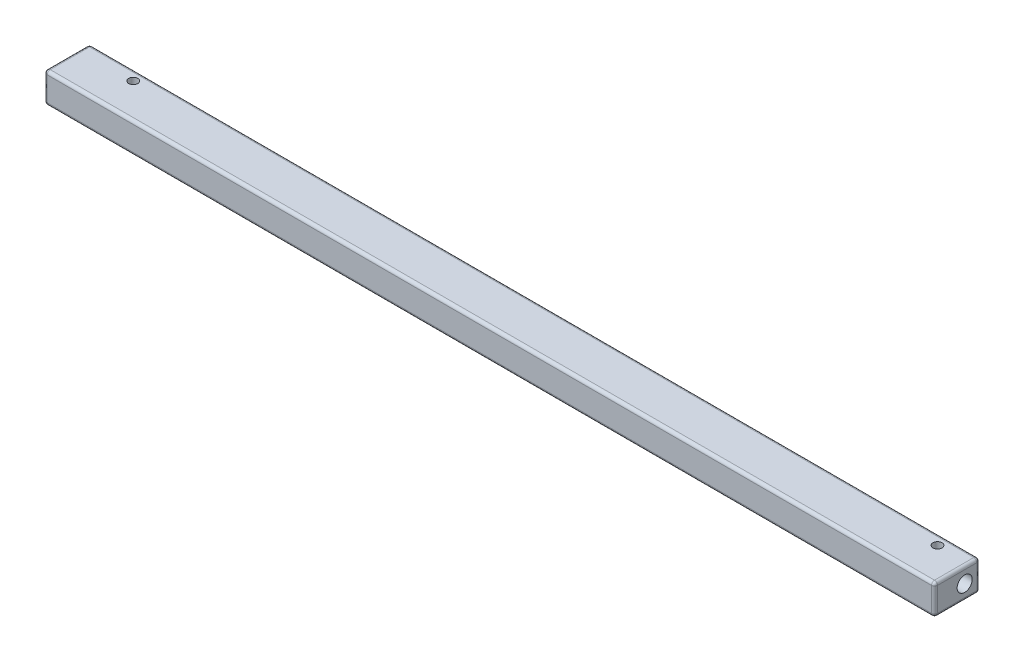
ISO-10303-21;
HEADER;
FILE_DESCRIPTION(('STEP AP214'),'2;1');
FILE_NAME('part.step','',(''),(''),'','','');
FILE_SCHEMA(('AUTOMOTIVE_DESIGN { 1 0 10303 214 1 1 1 1 }'));
ENDSEC;
DATA;
#1=APPLICATION_CONTEXT('core data for automotive mechanical design processes');
#2=APPLICATION_PROTOCOL_DEFINITION('international standard','automotive_design',2000,#1);
#3=PRODUCT_CONTEXT('',#1,'mechanical');
#4=PRODUCT('Part','Part','',(#3));
#5=PRODUCT_RELATED_PRODUCT_CATEGORY('part','',(#4));
#6=PRODUCT_DEFINITION_FORMATION('','',#4);
#7=PRODUCT_DEFINITION_CONTEXT('part definition',#1,'design');
#8=PRODUCT_DEFINITION('design','',#6,#7);
#9=PRODUCT_DEFINITION_SHAPE('','',#8);
#10=(LENGTH_UNIT() NAMED_UNIT(*) SI_UNIT(.MILLI.,.METRE.));
#11=(NAMED_UNIT(*) PLANE_ANGLE_UNIT() SI_UNIT($,.RADIAN.));
#12=(NAMED_UNIT(*) SI_UNIT($,.STERADIAN.) SOLID_ANGLE_UNIT());
#13=UNCERTAINTY_MEASURE_WITH_UNIT(LENGTH_MEASURE(1.E-05),#10,'distance_accuracy_value','');
#14=(GEOMETRIC_REPRESENTATION_CONTEXT(3) GLOBAL_UNCERTAINTY_ASSIGNED_CONTEXT((#13)) GLOBAL_UNIT_ASSIGNED_CONTEXT((#10,
#11,#12)) REPRESENTATION_CONTEXT('',''));
#15=CARTESIAN_POINT('',(0.,0.,0.));
#16=DIRECTION('',(0.,0.,1.));
#17=DIRECTION('',(1.,0.,0.));
#18=AXIS2_PLACEMENT_3D('',#15,#16,#17);
#19=CARTESIAN_POINT('',(-295.,20.,30.));
#20=DIRECTION('',(1.,0.,0.));
#21=DIRECTION('',(0.,0.,-1.));
#22=AXIS2_PLACEMENT_3D('',#19,#20,#21);
#23=PLANE('',#22);
#24=CARTESIAN_POINT('',(-295.,10.,15.));
#25=DIRECTION('',(-1.,0.,0.));
#26=DIRECTION('',(0.,0.,1.));
#27=AXIS2_PLACEMENT_3D('',#24,#25,#26);
#28=CIRCLE('',#27,5.);
#29=CARTESIAN_POINT('',(-295.,10.,20.));
#30=VERTEX_POINT('',#29);
#31=EDGE_CURVE('E450',#30,#30,#28,.T.);
#32=ORIENTED_EDGE('',*,*,#31,.F.);
#33=EDGE_LOOP('',(#32));
#34=FACE_BOUND('',#33,.T.);
#35=DIRECTION('',(0.,-1.,0.));
#36=VECTOR('',#35,1.);
#37=CARTESIAN_POINT('',(-295.,20.,2.));
#38=LINE('',#37,#36);
#39=CARTESIAN_POINT('',(-295.,18.,2.));
#40=VERTEX_POINT('',#39);
#41=CARTESIAN_POINT('',(-295.,2.,2.));
#42=VERTEX_POINT('',#41);
#43=EDGE_CURVE('E189',#40,#42,#38,.T.);
#44=ORIENTED_EDGE('',*,*,#43,.T.);
#45=DIRECTION('',(0.,0.,-1.));
#46=VECTOR('',#45,1.);
#47=CARTESIAN_POINT('',(-295.,2.,30.));
#48=LINE('',#47,#46);
#49=CARTESIAN_POINT('',(-295.,2.,28.));
#50=VERTEX_POINT('',#49);
#51=EDGE_CURVE('E192',#42,#50,#48,.F.);
#52=ORIENTED_EDGE('',*,*,#51,.T.);
#53=DIRECTION('',(0.,-1.,0.));
#54=VECTOR('',#53,1.);
#55=CARTESIAN_POINT('',(-295.,20.,28.));
#56=LINE('',#55,#54);
#57=CARTESIAN_POINT('',(-295.,18.,28.));
#58=VERTEX_POINT('',#57);
#59=EDGE_CURVE('E183',#50,#58,#56,.F.);
#60=ORIENTED_EDGE('',*,*,#59,.T.);
#61=DIRECTION('',(0.,0.,-1.));
#62=VECTOR('',#61,1.);
#63=CARTESIAN_POINT('',(-295.,18.,30.));
#64=LINE('',#63,#62);
#65=EDGE_CURVE('E186',#58,#40,#64,.T.);
#66=ORIENTED_EDGE('',*,*,#65,.T.);
#67=EDGE_LOOP('',(#44,#52,#60,#66));
#68=FACE_BOUND('',#67,.T.);
#69=ADVANCED_FACE('F42',(#34,#68),#23,.F.);
#70=CARTESIAN_POINT('',(-295.,0.,30.));
#71=DIRECTION('',(0.,1.,0.));
#72=DIRECTION('',(0.,0.,1.));
#73=AXIS2_PLACEMENT_3D('',#70,#71,#72);
#74=PLANE('',#73);
#75=CARTESIAN_POINT('',(274.,0.,7.));
#76=DIRECTION('',(0.,-1.,0.));
#77=DIRECTION('',(0.,0.,-1.));
#78=AXIS2_PLACEMENT_3D('',#75,#76,#77);
#79=CIRCLE('',#78,2.99999999999999);
#80=CARTESIAN_POINT('',(274.,0.,4.00000000000001));
#81=VERTEX_POINT('',#80);
#82=EDGE_CURVE('E444',#81,#81,#79,.T.);
#83=ORIENTED_EDGE('',*,*,#82,.F.);
#84=EDGE_LOOP('',(#83));
#85=FACE_BOUND('',#84,.T.);
#86=CARTESIAN_POINT('',(-259.,0.,7.));
#87=DIRECTION('',(0.,-1.,0.));
#88=DIRECTION('',(0.,0.,1.));
#89=AXIS2_PLACEMENT_3D('',#86,#87,#88);
#90=CIRCLE('',#89,2.99999999999999);
#91=CARTESIAN_POINT('',(-259.,0.,9.99999999999999));
#92=VERTEX_POINT('',#91);
#93=EDGE_CURVE('E446',#92,#92,#90,.T.);
#94=ORIENTED_EDGE('',*,*,#93,.F.);
#95=EDGE_LOOP('',(#94));
#96=FACE_BOUND('',#95,.T.);
#97=DIRECTION('',(1.,0.,0.));
#98=VECTOR('',#97,1.);
#99=CARTESIAN_POINT('',(-295.,0.,28.));
#100=LINE('',#99,#98);
#101=CARTESIAN_POINT('',(293.,0.,28.));
#102=VERTEX_POINT('',#101);
#103=CARTESIAN_POINT('',(-293.,0.,28.));
#104=VERTEX_POINT('',#103);
#105=EDGE_CURVE('E139',#102,#104,#100,.F.);
#106=ORIENTED_EDGE('',*,*,#105,.T.);
#107=DIRECTION('',(0.,0.,-1.));
#108=VECTOR('',#107,1.);
#109=CARTESIAN_POINT('',(-293.,0.,30.));
#110=LINE('',#109,#108);
#111=CARTESIAN_POINT('',(-293.,0.,2.));
#112=VERTEX_POINT('',#111);
#113=EDGE_CURVE('E180',#104,#112,#110,.T.);
#114=ORIENTED_EDGE('',*,*,#113,.T.);
#115=DIRECTION('',(1.,0.,0.));
#116=VECTOR('',#115,1.);
#117=CARTESIAN_POINT('',(-295.,0.,2.));
#118=LINE('',#117,#116);
#119=CARTESIAN_POINT('',(293.,0.,2.));
#120=VERTEX_POINT('',#119);
#121=EDGE_CURVE('E141',#112,#120,#118,.T.);
#122=ORIENTED_EDGE('',*,*,#121,.T.);
#123=DIRECTION('',(0.,0.,-1.));
#124=VECTOR('',#123,1.);
#125=CARTESIAN_POINT('',(293.,0.,30.));
#126=LINE('',#125,#124);
#127=EDGE_CURVE('E134',#120,#102,#126,.F.);
#128=ORIENTED_EDGE('',*,*,#127,.T.);
#129=EDGE_LOOP('',(#106,#114,#122,#128));
#130=FACE_BOUND('',#129,.T.);
#131=ADVANCED_FACE('F136',(#85,#96,#130),#74,.F.);
#132=CARTESIAN_POINT('',(295.,0.,30.));
#133=DIRECTION('',(-1.,0.,0.));
#134=DIRECTION('',(0.,0.,1.));
#135=AXIS2_PLACEMENT_3D('',#132,#133,#134);
#136=PLANE('',#135);
#137=CARTESIAN_POINT('',(295.,10.,10.));
#138=DIRECTION('',(1.,0.,0.));
#139=DIRECTION('',(0.,0.,-1.));
#140=AXIS2_PLACEMENT_3D('',#137,#138,#139);
#141=CIRCLE('',#140,5.);
#142=CARTESIAN_POINT('',(295.,10.,5.));
#143=VERTEX_POINT('',#142);
#144=EDGE_CURVE('E175',#143,#143,#141,.T.);
#145=ORIENTED_EDGE('',*,*,#144,.F.);
#146=EDGE_LOOP('',(#145));
#147=FACE_BOUND('',#146,.T.);
#148=DIRECTION('',(0.,0.,-1.));
#149=VECTOR('',#148,1.);
#150=CARTESIAN_POINT('',(295.,2.,30.));
#151=LINE('',#150,#149);
#152=CARTESIAN_POINT('',(295.,2.,28.));
#153=VERTEX_POINT('',#152);
#154=CARTESIAN_POINT('',(295.,2.,2.));
#155=VERTEX_POINT('',#154);
#156=EDGE_CURVE('E152',#153,#155,#151,.T.);
#157=ORIENTED_EDGE('',*,*,#156,.T.);
#158=DIRECTION('',(0.,1.,0.));
#159=VECTOR('',#158,1.);
#160=CARTESIAN_POINT('',(295.,0.,2.));
#161=LINE('',#160,#159);
#162=CARTESIAN_POINT('',(295.,18.,2.));
#163=VERTEX_POINT('',#162);
#164=EDGE_CURVE('E230',#155,#163,#161,.T.);
#165=ORIENTED_EDGE('',*,*,#164,.T.);
#166=DIRECTION('',(0.,0.,-1.));
#167=VECTOR('',#166,1.);
#168=CARTESIAN_POINT('',(295.,18.,30.));
#169=LINE('',#168,#167);
#170=CARTESIAN_POINT('',(295.,18.,28.));
#171=VERTEX_POINT('',#170);
#172=EDGE_CURVE('E225',#163,#171,#169,.F.);
#173=ORIENTED_EDGE('',*,*,#172,.T.);
#174=DIRECTION('',(0.,1.,0.));
#175=VECTOR('',#174,1.);
#176=CARTESIAN_POINT('',(295.,0.,28.));
#177=LINE('',#176,#175);
#178=EDGE_CURVE('E222',#171,#153,#177,.F.);
#179=ORIENTED_EDGE('',*,*,#178,.T.);
#180=EDGE_LOOP('',(#157,#165,#173,#179));
#181=FACE_BOUND('',#180,.T.);
#182=ADVANCED_FACE('F324',(#147,#181),#136,.F.);
#183=CARTESIAN_POINT('',(295.,20.,30.));
#184=DIRECTION('',(0.,-1.,0.));
#185=DIRECTION('',(0.,0.,-1.));
#186=AXIS2_PLACEMENT_3D('',#183,#184,#185);
#187=PLANE('',#186);
#188=CARTESIAN_POINT('',(274.,20.,7.));
#189=DIRECTION('',(0.,-1.,0.));
#190=DIRECTION('',(0.,0.,-1.));
#191=AXIS2_PLACEMENT_3D('',#188,#189,#190);
#192=CIRCLE('',#191,2.99999999999999);
#193=CARTESIAN_POINT('',(274.,20.,4.00000000000001));
#194=VERTEX_POINT('',#193);
#195=EDGE_CURVE('E441',#194,#194,#192,.T.);
#196=ORIENTED_EDGE('',*,*,#195,.T.);
#197=EDGE_LOOP('',(#196));
#198=FACE_BOUND('',#197,.T.);
#199=CARTESIAN_POINT('',(-259.,20.,7.));
#200=DIRECTION('',(0.,-1.,0.));
#201=DIRECTION('',(0.,0.,1.));
#202=AXIS2_PLACEMENT_3D('',#199,#200,#201);
#203=CIRCLE('',#202,2.99999999999999);
#204=CARTESIAN_POINT('',(-259.,20.,9.99999999999999));
#205=VERTEX_POINT('',#204);
#206=EDGE_CURVE('E453',#205,#205,#203,.T.);
#207=ORIENTED_EDGE('',*,*,#206,.T.);
#208=EDGE_LOOP('',(#207));
#209=FACE_BOUND('',#208,.T.);
#210=DIRECTION('',(-1.,0.,0.));
#211=VECTOR('',#210,1.);
#212=CARTESIAN_POINT('',(295.,20.,2.));
#213=LINE('',#212,#211);
#214=CARTESIAN_POINT('',(293.,20.,2.));
#215=VERTEX_POINT('',#214);
#216=CARTESIAN_POINT('',(-293.,20.,2.));
#217=VERTEX_POINT('',#216);
#218=EDGE_CURVE('E215',#215,#217,#213,.T.);
#219=ORIENTED_EDGE('',*,*,#218,.T.);
#220=DIRECTION('',(0.,0.,-1.));
#221=VECTOR('',#220,1.);
#222=CARTESIAN_POINT('',(-293.,20.,30.));
#223=LINE('',#222,#221);
#224=CARTESIAN_POINT('',(-293.,20.,28.));
#225=VERTEX_POINT('',#224);
#226=EDGE_CURVE('E218',#217,#225,#223,.F.);
#227=ORIENTED_EDGE('',*,*,#226,.T.);
#228=DIRECTION('',(-1.,0.,0.));
#229=VECTOR('',#228,1.);
#230=CARTESIAN_POINT('',(295.,20.,28.));
#231=LINE('',#230,#229);
#232=CARTESIAN_POINT('',(293.,20.,28.));
#233=VERTEX_POINT('',#232);
#234=EDGE_CURVE('E209',#225,#233,#231,.F.);
#235=ORIENTED_EDGE('',*,*,#234,.T.);
#236=DIRECTION('',(0.,0.,-1.));
#237=VECTOR('',#236,1.);
#238=CARTESIAN_POINT('',(293.,20.,30.));
#239=LINE('',#238,#237);
#240=EDGE_CURVE('E212',#233,#215,#239,.T.);
#241=ORIENTED_EDGE('',*,*,#240,.T.);
#242=EDGE_LOOP('',(#219,#227,#235,#241));
#243=FACE_BOUND('',#242,.T.);
#244=ADVANCED_FACE('F353',(#198,#209,#243),#187,.F.);
#245=CARTESIAN_POINT('',(0.,0.,30.));
#246=DIRECTION('',(0.,0.,1.));
#247=DIRECTION('',(1.,0.,0.));
#248=AXIS2_PLACEMENT_3D('',#245,#246,#247);
#249=PLANE('',#248);
#250=DIRECTION('',(0.,-1.,0.));
#251=VECTOR('',#250,1.);
#252=CARTESIAN_POINT('',(-293.,0.,30.));
#253=LINE('',#252,#251);
#254=CARTESIAN_POINT('',(-293.,18.,30.));
#255=VERTEX_POINT('',#254);
#256=CARTESIAN_POINT('',(-293.,2.,30.));
#257=VERTEX_POINT('',#256);
#258=EDGE_CURVE('E52',#255,#257,#253,.T.);
#259=ORIENTED_EDGE('',*,*,#258,.T.);
#260=DIRECTION('',(1.,0.,0.));
#261=VECTOR('',#260,1.);
#262=CARTESIAN_POINT('',(295.,2.,30.));
#263=LINE('',#262,#261);
#264=CARTESIAN_POINT('',(293.,2.,30.));
#265=VERTEX_POINT('',#264);
#266=EDGE_CURVE('E11',#257,#265,#263,.T.);
#267=ORIENTED_EDGE('',*,*,#266,.T.);
#268=DIRECTION('',(0.,1.,0.));
#269=VECTOR('',#268,1.);
#270=CARTESIAN_POINT('',(293.,20.,30.));
#271=LINE('',#270,#269);
#272=CARTESIAN_POINT('',(293.,18.,30.));
#273=VERTEX_POINT('',#272);
#274=EDGE_CURVE('E237',#265,#273,#271,.T.);
#275=ORIENTED_EDGE('',*,*,#274,.T.);
#276=DIRECTION('',(-1.,0.,0.));
#277=VECTOR('',#276,1.);
#278=CARTESIAN_POINT('',(-295.,18.,30.));
#279=LINE('',#278,#277);
#280=EDGE_CURVE('E234',#273,#255,#279,.T.);
#281=ORIENTED_EDGE('',*,*,#280,.T.);
#282=EDGE_LOOP('',(#259,#267,#275,#281));
#283=FACE_BOUND('',#282,.T.);
#284=ADVANCED_FACE('F371',(#283),#249,.T.);
#285=CARTESIAN_POINT('',(0.,0.,0.));
#286=DIRECTION('',(0.,0.,1.));
#287=DIRECTION('',(1.,0.,0.));
#288=AXIS2_PLACEMENT_3D('',#285,#286,#287);
#289=PLANE('',#288);
#290=DIRECTION('',(1.,0.,0.));
#291=VECTOR('',#290,1.);
#292=CARTESIAN_POINT('',(0.,2.,0.));
#293=LINE('',#292,#291);
#294=CARTESIAN_POINT('',(293.,2.,0.));
#295=VERTEX_POINT('',#294);
#296=CARTESIAN_POINT('',(-293.,2.,0.));
#297=VERTEX_POINT('',#296);
#298=EDGE_CURVE('E202',#295,#297,#293,.F.);
#299=ORIENTED_EDGE('',*,*,#298,.T.);
#300=DIRECTION('',(0.,-1.,0.));
#301=VECTOR('',#300,1.);
#302=CARTESIAN_POINT('',(-293.,0.,0.));
#303=LINE('',#302,#301);
#304=CARTESIAN_POINT('',(-293.,18.,0.));
#305=VERTEX_POINT('',#304);
#306=EDGE_CURVE('E205',#297,#305,#303,.F.);
#307=ORIENTED_EDGE('',*,*,#306,.T.);
#308=DIRECTION('',(-1.,0.,0.));
#309=VECTOR('',#308,1.);
#310=CARTESIAN_POINT('',(0.,18.,0.));
#311=LINE('',#310,#309);
#312=CARTESIAN_POINT('',(293.,18.,0.));
#313=VERTEX_POINT('',#312);
#314=EDGE_CURVE('E199',#305,#313,#311,.F.);
#315=ORIENTED_EDGE('',*,*,#314,.T.);
#316=DIRECTION('',(0.,1.,0.));
#317=VECTOR('',#316,1.);
#318=CARTESIAN_POINT('',(293.,0.,0.));
#319=LINE('',#318,#317);
#320=EDGE_CURVE('E196',#313,#295,#319,.F.);
#321=ORIENTED_EDGE('',*,*,#320,.T.);
#322=EDGE_LOOP('',(#299,#307,#315,#321));
#323=FACE_BOUND('',#322,.T.);
#324=ADVANCED_FACE('F337',(#323),#289,.F.);
#325=CARTESIAN_POINT('',(293.,18.,30.));
#326=DIRECTION('',(0.,0.,-1.));
#327=DIRECTION('',(-1.,0.,0.));
#328=AXIS2_PLACEMENT_3D('',#325,#326,#327);
#329=CYLINDRICAL_SURFACE('',#328,2.);
#330=CARTESIAN_POINT('',(293.,18.,28.));
#331=DIRECTION('',(0.,0.,1.));
#332=DIRECTION('',(1.,0.,0.));
#333=AXIS2_PLACEMENT_3D('',#330,#331,#332);
#334=CIRCLE('',#333,2.);
#335=EDGE_CURVE('E46',#171,#233,#334,.T.);
#336=ORIENTED_EDGE('',*,*,#335,.F.);
#337=ORIENTED_EDGE('',*,*,#172,.F.);
#338=CARTESIAN_POINT('',(293.,18.,2.));
#339=DIRECTION('',(0.,0.,-1.));
#340=DIRECTION('',(-1.,0.,0.));
#341=AXIS2_PLACEMENT_3D('',#338,#339,#340);
#342=CIRCLE('',#341,2.);
#343=EDGE_CURVE('E173',#215,#163,#342,.T.);
#344=ORIENTED_EDGE('',*,*,#343,.F.);
#345=ORIENTED_EDGE('',*,*,#240,.F.);
#346=EDGE_LOOP('',(#336,#337,#344,#345));
#347=FACE_BOUND('',#346,.T.);
#348=ADVANCED_FACE('F44',(#347),#329,.T.);
#349=CARTESIAN_POINT('',(293.,18.,28.));
#350=DIRECTION('',(0.,1.,0.));
#351=DIRECTION('',(0.,0.,1.));
#352=AXIS2_PLACEMENT_3D('',#349,#350,#351);
#353=SPHERICAL_SURFACE('',#352,2.);
#354=CARTESIAN_POINT('',(293.,18.,28.));
#355=DIRECTION('',(0.,1.,0.));
#356=DIRECTION('',(0.,0.,1.));
#357=AXIS2_PLACEMENT_3D('',#354,#355,#356);
#358=CIRCLE('',#357,2.);
#359=EDGE_CURVE('E301',#171,#273,#358,.F.);
#360=ORIENTED_EDGE('',*,*,#359,.F.);
#361=ORIENTED_EDGE('',*,*,#335,.T.);
#362=CARTESIAN_POINT('',(293.,18.,28.));
#363=DIRECTION('',(1.,0.,0.));
#364=DIRECTION('',(0.,0.,-1.));
#365=AXIS2_PLACEMENT_3D('',#362,#363,#364);
#366=CIRCLE('',#365,2.);
#367=EDGE_CURVE('E305',#273,#233,#366,.F.);
#368=ORIENTED_EDGE('',*,*,#367,.F.);
#369=EDGE_LOOP('',(#360,#361,#368));
#370=FACE_BOUND('',#369,.T.);
#371=ADVANCED_FACE('F367',(#370),#353,.T.);
#372=CARTESIAN_POINT('',(293.,18.,2.));
#373=DIRECTION('',(1.,0.,0.));
#374=DIRECTION('',(0.,0.,-1.));
#375=AXIS2_PLACEMENT_3D('',#372,#373,#374);
#376=SPHERICAL_SURFACE('',#375,2.);
#377=CARTESIAN_POINT('',(293.,18.,2.));
#378=DIRECTION('',(1.,0.,0.));
#379=DIRECTION('',(0.,0.,-1.));
#380=AXIS2_PLACEMENT_3D('',#377,#378,#379);
#381=CIRCLE('',#380,2.);
#382=EDGE_CURVE('E294',#215,#313,#381,.F.);
#383=ORIENTED_EDGE('',*,*,#382,.F.);
#384=ORIENTED_EDGE('',*,*,#343,.T.);
#385=CARTESIAN_POINT('',(293.,18.,2.));
#386=DIRECTION('',(0.,1.,0.));
#387=DIRECTION('',(0.,0.,1.));
#388=AXIS2_PLACEMENT_3D('',#385,#386,#387);
#389=CIRCLE('',#388,2.);
#390=EDGE_CURVE('E298',#313,#163,#389,.F.);
#391=ORIENTED_EDGE('',*,*,#390,.F.);
#392=EDGE_LOOP('',(#383,#384,#391));
#393=FACE_BOUND('',#392,.T.);
#394=ADVANCED_FACE('F315',(#393),#376,.T.);
#395=CARTESIAN_POINT('',(0.,18.,28.));
#396=DIRECTION('',(1.,0.,0.));
#397=DIRECTION('',(0.,0.,-1.));
#398=AXIS2_PLACEMENT_3D('',#395,#396,#397);
#399=CYLINDRICAL_SURFACE('',#398,2.);
#400=ORIENTED_EDGE('',*,*,#367,.T.);
#401=ORIENTED_EDGE('',*,*,#234,.F.);
#402=CARTESIAN_POINT('',(-293.,18.,28.));
#403=DIRECTION('',(-1.,0.,0.));
#404=DIRECTION('',(0.,0.,1.));
#405=AXIS2_PLACEMENT_3D('',#402,#403,#404);
#406=CIRCLE('',#405,2.);
#407=EDGE_CURVE('E287',#255,#225,#406,.T.);
#408=ORIENTED_EDGE('',*,*,#407,.F.);
#409=ORIENTED_EDGE('',*,*,#280,.F.);
#410=EDGE_LOOP('',(#400,#401,#408,#409));
#411=FACE_BOUND('',#410,.T.);
#412=ADVANCED_FACE('F363',(#411),#399,.T.);
#413=CARTESIAN_POINT('',(293.,0.,28.));
#414=DIRECTION('',(0.,-1.,0.));
#415=DIRECTION('',(0.,0.,-1.));
#416=AXIS2_PLACEMENT_3D('',#413,#414,#415);
#417=CYLINDRICAL_SURFACE('',#416,2.);
#418=ORIENTED_EDGE('',*,*,#359,.T.);
#419=ORIENTED_EDGE('',*,*,#274,.F.);
#420=CARTESIAN_POINT('',(293.,2.,28.));
#421=DIRECTION('',(0.,-1.,0.));
#422=DIRECTION('',(0.,0.,-1.));
#423=AXIS2_PLACEMENT_3D('',#420,#421,#422);
#424=CIRCLE('',#423,2.);
#425=EDGE_CURVE('E157',#153,#265,#424,.T.);
#426=ORIENTED_EDGE('',*,*,#425,.F.);
#427=ORIENTED_EDGE('',*,*,#178,.F.);
#428=EDGE_LOOP('',(#418,#419,#426,#427));
#429=FACE_BOUND('',#428,.T.);
#430=ADVANCED_FACE('F370',(#429),#417,.T.);
#431=CARTESIAN_POINT('',(293.,2.,30.));
#432=DIRECTION('',(0.,0.,-1.));
#433=DIRECTION('',(-1.,0.,0.));
#434=AXIS2_PLACEMENT_3D('',#431,#432,#433);
#435=CYLINDRICAL_SURFACE('',#434,2.);
#436=CARTESIAN_POINT('',(293.,2.,2.));
#437=DIRECTION('',(0.,0.,-1.));
#438=DIRECTION('',(-1.,0.,0.));
#439=AXIS2_PLACEMENT_3D('',#436,#437,#438);
#440=CIRCLE('',#439,2.);
#441=EDGE_CURVE('E158',#155,#120,#440,.T.);
#442=ORIENTED_EDGE('',*,*,#441,.F.);
#443=ORIENTED_EDGE('',*,*,#156,.F.);
#444=CARTESIAN_POINT('',(293.,2.,28.));
#445=DIRECTION('',(0.,0.,1.));
#446=DIRECTION('',(1.,0.,0.));
#447=AXIS2_PLACEMENT_3D('',#444,#445,#446);
#448=CIRCLE('',#447,2.);
#449=EDGE_CURVE('E149',#102,#153,#448,.T.);
#450=ORIENTED_EDGE('',*,*,#449,.F.);
#451=ORIENTED_EDGE('',*,*,#127,.F.);
#452=EDGE_LOOP('',(#442,#443,#450,#451));
#453=FACE_BOUND('',#452,.T.);
#454=ADVANCED_FACE('F151',(#453),#435,.T.);
#455=CARTESIAN_POINT('',(293.,0.,2.));
#456=DIRECTION('',(0.,1.,0.));
#457=DIRECTION('',(0.,0.,1.));
#458=AXIS2_PLACEMENT_3D('',#455,#456,#457);
#459=CYLINDRICAL_SURFACE('',#458,2.);
#460=ORIENTED_EDGE('',*,*,#390,.T.);
#461=ORIENTED_EDGE('',*,*,#164,.F.);
#462=CARTESIAN_POINT('',(293.,2.,2.));
#463=DIRECTION('',(0.,-1.,0.));
#464=DIRECTION('',(0.,0.,-1.));
#465=AXIS2_PLACEMENT_3D('',#462,#463,#464);
#466=CIRCLE('',#465,2.);
#467=EDGE_CURVE('E279',#295,#155,#466,.T.);
#468=ORIENTED_EDGE('',*,*,#467,.F.);
#469=ORIENTED_EDGE('',*,*,#320,.F.);
#470=EDGE_LOOP('',(#460,#461,#468,#469));
#471=FACE_BOUND('',#470,.T.);
#472=ADVANCED_FACE('F327',(#471),#459,.T.);
#473=CARTESIAN_POINT('',(295.,18.,2.));
#474=DIRECTION('',(-1.,0.,0.));
#475=DIRECTION('',(0.,0.,1.));
#476=AXIS2_PLACEMENT_3D('',#473,#474,#475);
#477=CYLINDRICAL_SURFACE('',#476,2.);
#478=ORIENTED_EDGE('',*,*,#382,.T.);
#479=ORIENTED_EDGE('',*,*,#314,.F.);
#480=CARTESIAN_POINT('',(-293.,18.,2.));
#481=DIRECTION('',(-1.,0.,0.));
#482=DIRECTION('',(0.,0.,1.));
#483=AXIS2_PLACEMENT_3D('',#480,#481,#482);
#484=CIRCLE('',#483,2.);
#485=EDGE_CURVE('E275',#217,#305,#484,.T.);
#486=ORIENTED_EDGE('',*,*,#485,.F.);
#487=ORIENTED_EDGE('',*,*,#218,.F.);
#488=EDGE_LOOP('',(#478,#479,#486,#487));
#489=FACE_BOUND('',#488,.T.);
#490=ADVANCED_FACE('F350',(#489),#477,.T.);
#491=CARTESIAN_POINT('',(-293.,18.,30.));
#492=DIRECTION('',(0.,0.,-1.));
#493=DIRECTION('',(-1.,0.,0.));
#494=AXIS2_PLACEMENT_3D('',#491,#492,#493);
#495=CYLINDRICAL_SURFACE('',#494,2.);
#496=CARTESIAN_POINT('',(-293.,18.,28.));
#497=DIRECTION('',(0.,0.,1.));
#498=DIRECTION('',(1.,0.,0.));
#499=AXIS2_PLACEMENT_3D('',#496,#497,#498);
#500=CIRCLE('',#499,2.);
#501=EDGE_CURVE('E290',#225,#58,#500,.T.);
#502=ORIENTED_EDGE('',*,*,#501,.F.);
#503=ORIENTED_EDGE('',*,*,#226,.F.);
#504=CARTESIAN_POINT('',(-293.,18.,2.));
#505=DIRECTION('',(0.,0.,-1.));
#506=DIRECTION('',(-1.,0.,0.));
#507=AXIS2_PLACEMENT_3D('',#504,#505,#506);
#508=CIRCLE('',#507,2.);
#509=EDGE_CURVE('E271',#40,#217,#508,.T.);
#510=ORIENTED_EDGE('',*,*,#509,.F.);
#511=ORIENTED_EDGE('',*,*,#65,.F.);
#512=EDGE_LOOP('',(#502,#503,#510,#511));
#513=FACE_BOUND('',#512,.T.);
#514=ADVANCED_FACE('F356',(#513),#495,.T.);
#515=CARTESIAN_POINT('',(-293.,18.,28.));
#516=DIRECTION('',(0.,1.,0.));
#517=DIRECTION('',(0.,0.,1.));
#518=AXIS2_PLACEMENT_3D('',#515,#516,#517);
#519=SPHERICAL_SURFACE('',#518,2.);
#520=ORIENTED_EDGE('',*,*,#407,.T.);
#521=ORIENTED_EDGE('',*,*,#501,.T.);
#522=CARTESIAN_POINT('',(-293.,18.,28.));
#523=DIRECTION('',(0.,1.,0.));
#524=DIRECTION('',(0.,0.,1.));
#525=AXIS2_PLACEMENT_3D('',#522,#523,#524);
#526=CIRCLE('',#525,2.);
#527=EDGE_CURVE('E165',#255,#58,#526,.F.);
#528=ORIENTED_EDGE('',*,*,#527,.F.);
#529=EDGE_LOOP('',(#520,#521,#528));
#530=FACE_BOUND('',#529,.T.);
#531=ADVANCED_FACE('F585',(#530),#519,.T.);
#532=CARTESIAN_POINT('',(293.,2.,28.));
#533=DIRECTION('',(1.,0.,0.));
#534=DIRECTION('',(0.,0.,-1.));
#535=AXIS2_PLACEMENT_3D('',#532,#533,#534);
#536=SPHERICAL_SURFACE('',#535,2.);
#537=ORIENTED_EDGE('',*,*,#449,.T.);
#538=ORIENTED_EDGE('',*,*,#425,.T.);
#539=CARTESIAN_POINT('',(293.,2.,28.));
#540=DIRECTION('',(1.,0.,0.));
#541=DIRECTION('',(0.,0.,-1.));
#542=AXIS2_PLACEMENT_3D('',#539,#540,#541);
#543=CIRCLE('',#542,2.);
#544=EDGE_CURVE('E161',#102,#265,#543,.F.);
#545=ORIENTED_EDGE('',*,*,#544,.F.);
#546=EDGE_LOOP('',(#537,#538,#545));
#547=FACE_BOUND('',#546,.T.);
#548=ADVANCED_FACE('F162',(#547),#536,.T.);
#549=CARTESIAN_POINT('',(293.,2.,2.));
#550=DIRECTION('',(1.,0.,0.));
#551=DIRECTION('',(0.,0.,-1.));
#552=AXIS2_PLACEMENT_3D('',#549,#550,#551);
#553=SPHERICAL_SURFACE('',#552,2.);
#554=ORIENTED_EDGE('',*,*,#467,.T.);
#555=ORIENTED_EDGE('',*,*,#441,.T.);
#556=CARTESIAN_POINT('',(293.,2.,2.));
#557=DIRECTION('',(1.,0.,0.));
#558=DIRECTION('',(0.,0.,-1.));
#559=AXIS2_PLACEMENT_3D('',#556,#557,#558);
#560=CIRCLE('',#559,2.);
#561=EDGE_CURVE('E166',#295,#120,#560,.F.);
#562=ORIENTED_EDGE('',*,*,#561,.F.);
#563=EDGE_LOOP('',(#554,#555,#562));
#564=FACE_BOUND('',#563,.T.);
#565=ADVANCED_FACE('F330',(#564),#553,.T.);
#566=CARTESIAN_POINT('',(-293.,18.,2.));
#567=DIRECTION('',(0.,1.,0.));
#568=DIRECTION('',(0.,0.,1.));
#569=AXIS2_PLACEMENT_3D('',#566,#567,#568);
#570=SPHERICAL_SURFACE('',#569,2.);
#571=ORIENTED_EDGE('',*,*,#509,.T.);
#572=ORIENTED_EDGE('',*,*,#485,.T.);
#573=CARTESIAN_POINT('',(-293.,18.,2.));
#574=DIRECTION('',(0.,1.,0.));
#575=DIRECTION('',(0.,0.,1.));
#576=AXIS2_PLACEMENT_3D('',#573,#574,#575);
#577=CIRCLE('',#576,2.);
#578=EDGE_CURVE('E262',#40,#305,#577,.F.);
#579=ORIENTED_EDGE('',*,*,#578,.F.);
#580=EDGE_LOOP('',(#571,#572,#579));
#581=FACE_BOUND('',#580,.T.);
#582=ADVANCED_FACE('F347',(#581),#570,.T.);
#583=CARTESIAN_POINT('',(-293.,0.,28.));
#584=DIRECTION('',(0.,1.,0.));
#585=DIRECTION('',(0.,0.,1.));
#586=AXIS2_PLACEMENT_3D('',#583,#584,#585);
#587=CYLINDRICAL_SURFACE('',#586,2.);
#588=ORIENTED_EDGE('',*,*,#527,.T.);
#589=ORIENTED_EDGE('',*,*,#59,.F.);
#590=CARTESIAN_POINT('',(-293.,2.,28.));
#591=DIRECTION('',(0.,-1.,0.));
#592=DIRECTION('',(0.,0.,-1.));
#593=AXIS2_PLACEMENT_3D('',#590,#591,#592);
#594=CIRCLE('',#593,2.);
#595=EDGE_CURVE('E259',#257,#50,#594,.T.);
#596=ORIENTED_EDGE('',*,*,#595,.F.);
#597=ORIENTED_EDGE('',*,*,#258,.F.);
#598=EDGE_LOOP('',(#588,#589,#596,#597));
#599=FACE_BOUND('',#598,.T.);
#600=ADVANCED_FACE('F374',(#599),#587,.T.);
#601=CARTESIAN_POINT('',(0.,2.,28.));
#602=DIRECTION('',(-1.,0.,0.));
#603=DIRECTION('',(0.,0.,1.));
#604=AXIS2_PLACEMENT_3D('',#601,#602,#603);
#605=CYLINDRICAL_SURFACE('',#604,2.);
#606=ORIENTED_EDGE('',*,*,#544,.T.);
#607=ORIENTED_EDGE('',*,*,#266,.F.);
#608=CARTESIAN_POINT('',(-293.,2.,28.));
#609=DIRECTION('',(-1.,0.,0.));
#610=DIRECTION('',(0.,0.,1.));
#611=AXIS2_PLACEMENT_3D('',#608,#609,#610);
#612=CIRCLE('',#611,2.);
#613=EDGE_CURVE('E60',#104,#257,#612,.T.);
#614=ORIENTED_EDGE('',*,*,#613,.F.);
#615=ORIENTED_EDGE('',*,*,#105,.F.);
#616=EDGE_LOOP('',(#606,#607,#614,#615));
#617=FACE_BOUND('',#616,.T.);
#618=ADVANCED_FACE('F168',(#617),#605,.T.);
#619=CARTESIAN_POINT('',(-295.,2.,2.));
#620=DIRECTION('',(1.,0.,0.));
#621=DIRECTION('',(0.,0.,-1.));
#622=AXIS2_PLACEMENT_3D('',#619,#620,#621);
#623=CYLINDRICAL_SURFACE('',#622,2.);
#624=ORIENTED_EDGE('',*,*,#561,.T.);
#625=ORIENTED_EDGE('',*,*,#121,.F.);
#626=CARTESIAN_POINT('',(-293.,2.,2.));
#627=DIRECTION('',(-1.,0.,0.));
#628=DIRECTION('',(0.,0.,1.));
#629=AXIS2_PLACEMENT_3D('',#626,#627,#628);
#630=CIRCLE('',#629,2.);
#631=EDGE_CURVE('E253',#297,#112,#630,.T.);
#632=ORIENTED_EDGE('',*,*,#631,.F.);
#633=ORIENTED_EDGE('',*,*,#298,.F.);
#634=EDGE_LOOP('',(#624,#625,#632,#633));
#635=FACE_BOUND('',#634,.T.);
#636=ADVANCED_FACE('F334',(#635),#623,.T.);
#637=CARTESIAN_POINT('',(-293.,20.,2.));
#638=DIRECTION('',(0.,-1.,0.));
#639=DIRECTION('',(0.,0.,-1.));
#640=AXIS2_PLACEMENT_3D('',#637,#638,#639);
#641=CYLINDRICAL_SURFACE('',#640,2.);
#642=ORIENTED_EDGE('',*,*,#578,.T.);
#643=ORIENTED_EDGE('',*,*,#306,.F.);
#644=CARTESIAN_POINT('',(-293.,2.,2.));
#645=DIRECTION('',(0.,-1.,0.));
#646=DIRECTION('',(0.,0.,-1.));
#647=AXIS2_PLACEMENT_3D('',#644,#645,#646);
#648=CIRCLE('',#647,2.);
#649=EDGE_CURVE('E249',#42,#297,#648,.T.);
#650=ORIENTED_EDGE('',*,*,#649,.F.);
#651=ORIENTED_EDGE('',*,*,#43,.F.);
#652=EDGE_LOOP('',(#642,#643,#650,#651));
#653=FACE_BOUND('',#652,.T.);
#654=ADVANCED_FACE('F340',(#653),#641,.T.);
#655=CARTESIAN_POINT('',(-293.,2.,28.));
#656=DIRECTION('',(0.,0.,1.));
#657=DIRECTION('',(1.,0.,0.));
#658=AXIS2_PLACEMENT_3D('',#655,#656,#657);
#659=SPHERICAL_SURFACE('',#658,2.);
#660=ORIENTED_EDGE('',*,*,#613,.T.);
#661=ORIENTED_EDGE('',*,*,#595,.T.);
#662=CARTESIAN_POINT('',(-293.,2.,28.));
#663=DIRECTION('',(0.,0.,1.));
#664=DIRECTION('',(1.,0.,0.));
#665=AXIS2_PLACEMENT_3D('',#662,#663,#664);
#666=CIRCLE('',#665,2.);
#667=EDGE_CURVE('E245',#104,#50,#666,.F.);
#668=ORIENTED_EDGE('',*,*,#667,.F.);
#669=EDGE_LOOP('',(#660,#661,#668));
#670=FACE_BOUND('',#669,.T.);
#671=ADVANCED_FACE('F376',(#670),#659,.T.);
#672=CARTESIAN_POINT('',(-293.,2.,2.));
#673=DIRECTION('',(0.,0.,-1.));
#674=DIRECTION('',(-1.,0.,0.));
#675=AXIS2_PLACEMENT_3D('',#672,#673,#674);
#676=SPHERICAL_SURFACE('',#675,2.);
#677=ORIENTED_EDGE('',*,*,#649,.T.);
#678=ORIENTED_EDGE('',*,*,#631,.T.);
#679=CARTESIAN_POINT('',(-293.,2.,2.));
#680=DIRECTION('',(0.,0.,-1.));
#681=DIRECTION('',(-1.,0.,0.));
#682=AXIS2_PLACEMENT_3D('',#679,#680,#681);
#683=CIRCLE('',#682,2.);
#684=EDGE_CURVE('E242',#42,#112,#683,.F.);
#685=ORIENTED_EDGE('',*,*,#684,.F.);
#686=EDGE_LOOP('',(#677,#678,#685));
#687=FACE_BOUND('',#686,.T.);
#688=ADVANCED_FACE('F382',(#687),#676,.T.);
#689=CARTESIAN_POINT('',(-293.,2.,30.));
#690=DIRECTION('',(0.,0.,-1.));
#691=DIRECTION('',(-1.,0.,0.));
#692=AXIS2_PLACEMENT_3D('',#689,#690,#691);
#693=CYLINDRICAL_SURFACE('',#692,2.);
#694=ORIENTED_EDGE('',*,*,#667,.T.);
#695=ORIENTED_EDGE('',*,*,#51,.F.);
#696=ORIENTED_EDGE('',*,*,#684,.T.);
#697=ORIENTED_EDGE('',*,*,#113,.F.);
#698=EDGE_LOOP('',(#694,#695,#696,#697));
#699=FACE_BOUND('',#698,.T.);
#700=ADVANCED_FACE('F379',(#699),#693,.T.);
#701=CARTESIAN_POINT('',(287.,10.,10.));
#702=DIRECTION('',(1.,0.,0.));
#703=DIRECTION('',(0.,0.,-1.));
#704=AXIS2_PLACEMENT_3D('',#701,#702,#703);
#705=CYLINDRICAL_SURFACE('',#704,5.);
#706=CARTESIAN_POINT('',(287.,10.,10.));
#707=DIRECTION('',(1.,0.,0.));
#708=DIRECTION('',(0.,0.,-1.));
#709=AXIS2_PLACEMENT_3D('',#706,#707,#708);
#710=CIRCLE('',#709,5.);
#711=CARTESIAN_POINT('',(287.,10.,5.));
#712=VERTEX_POINT('',#711);
#713=EDGE_CURVE('E246',#712,#712,#710,.T.);
#714=ORIENTED_EDGE('',*,*,#713,.F.);
#715=EDGE_LOOP('',(#714));
#716=FACE_BOUND('',#715,.T.);
#717=ORIENTED_EDGE('',*,*,#144,.T.);
#718=EDGE_LOOP('',(#717));
#719=FACE_BOUND('',#718,.T.);
#720=ADVANCED_FACE('F389',(#716,#719),#705,.F.);
#721=CARTESIAN_POINT('',(287.,10.,10.));
#722=DIRECTION('',(1.,0.,0.));
#723=DIRECTION('',(0.,0.,-1.));
#724=AXIS2_PLACEMENT_3D('',#721,#722,#723);
#725=PLANE('',#724);
#726=ORIENTED_EDGE('',*,*,#713,.T.);
#727=EDGE_LOOP('',(#726));
#728=FACE_BOUND('',#727,.T.);
#729=ADVANCED_FACE('F416',(#728),#725,.T.);
#730=CARTESIAN_POINT('',(-287.,10.,15.));
#731=DIRECTION('',(-1.,0.,0.));
#732=DIRECTION('',(0.,0.,1.));
#733=AXIS2_PLACEMENT_3D('',#730,#731,#732);
#734=CYLINDRICAL_SURFACE('',#733,5.);
#735=CARTESIAN_POINT('',(-287.,10.,15.));
#736=DIRECTION('',(-1.,0.,0.));
#737=DIRECTION('',(0.,0.,1.));
#738=AXIS2_PLACEMENT_3D('',#735,#736,#737);
#739=CIRCLE('',#738,5.);
#740=CARTESIAN_POINT('',(-287.,10.,20.));
#741=VERTEX_POINT('',#740);
#742=EDGE_CURVE('E459',#741,#741,#739,.T.);
#743=ORIENTED_EDGE('',*,*,#742,.F.);
#744=EDGE_LOOP('',(#743));
#745=FACE_BOUND('',#744,.T.);
#746=ORIENTED_EDGE('',*,*,#31,.T.);
#747=EDGE_LOOP('',(#746));
#748=FACE_BOUND('',#747,.T.);
#749=ADVANCED_FACE('F420',(#745,#748),#734,.F.);
#750=CARTESIAN_POINT('',(-287.,10.,15.));
#751=DIRECTION('',(-1.,0.,0.));
#752=DIRECTION('',(0.,0.,1.));
#753=AXIS2_PLACEMENT_3D('',#750,#751,#752);
#754=PLANE('',#753);
#755=ORIENTED_EDGE('',*,*,#742,.T.);
#756=EDGE_LOOP('',(#755));
#757=FACE_BOUND('',#756,.T.);
#758=ADVANCED_FACE('F424',(#757),#754,.T.);
#759=CARTESIAN_POINT('',(-259.,20.,7.));
#760=DIRECTION('',(0.,-1.,0.));
#761=DIRECTION('',(0.,0.,-1.));
#762=AXIS2_PLACEMENT_3D('',#759,#760,#761);
#763=CYLINDRICAL_SURFACE('',#762,2.99999999999999);
#764=ORIENTED_EDGE('',*,*,#206,.F.);
#765=EDGE_LOOP('',(#764));
#766=FACE_BOUND('',#765,.T.);
#767=ORIENTED_EDGE('',*,*,#93,.T.);
#768=EDGE_LOOP('',(#767));
#769=FACE_BOUND('',#768,.T.);
#770=ADVANCED_FACE('F428',(#766,#769),#763,.F.);
#771=CARTESIAN_POINT('',(274.,20.,7.));
#772=DIRECTION('',(0.,-1.,0.));
#773=DIRECTION('',(0.,0.,-1.));
#774=AXIS2_PLACEMENT_3D('',#771,#772,#773);
#775=CYLINDRICAL_SURFACE('',#774,2.99999999999999);
#776=ORIENTED_EDGE('',*,*,#195,.F.);
#777=EDGE_LOOP('',(#776));
#778=FACE_BOUND('',#777,.T.);
#779=ORIENTED_EDGE('',*,*,#82,.T.);
#780=EDGE_LOOP('',(#779));
#781=FACE_BOUND('',#780,.T.);
#782=ADVANCED_FACE('F432',(#778,#781),#775,.F.);
#783=CLOSED_SHELL('',(#69,#131,#182,#244,#284,#324,#348,#371,#394,#412,#430,#454,#472,#490,#514,
#531,#548,#565,#582,#600,#618,#636,#654,#671,#688,#700,#720,#729,#749,#758,#770,#782));
#784=MANIFOLD_SOLID_BREP('B2',#783);
#785=ADVANCED_BREP_SHAPE_REPRESENTATION('',(#18,#784),#14);
#786=SHAPE_DEFINITION_REPRESENTATION(#9,#785);
ENDSEC;
END-ISO-10303-21;
